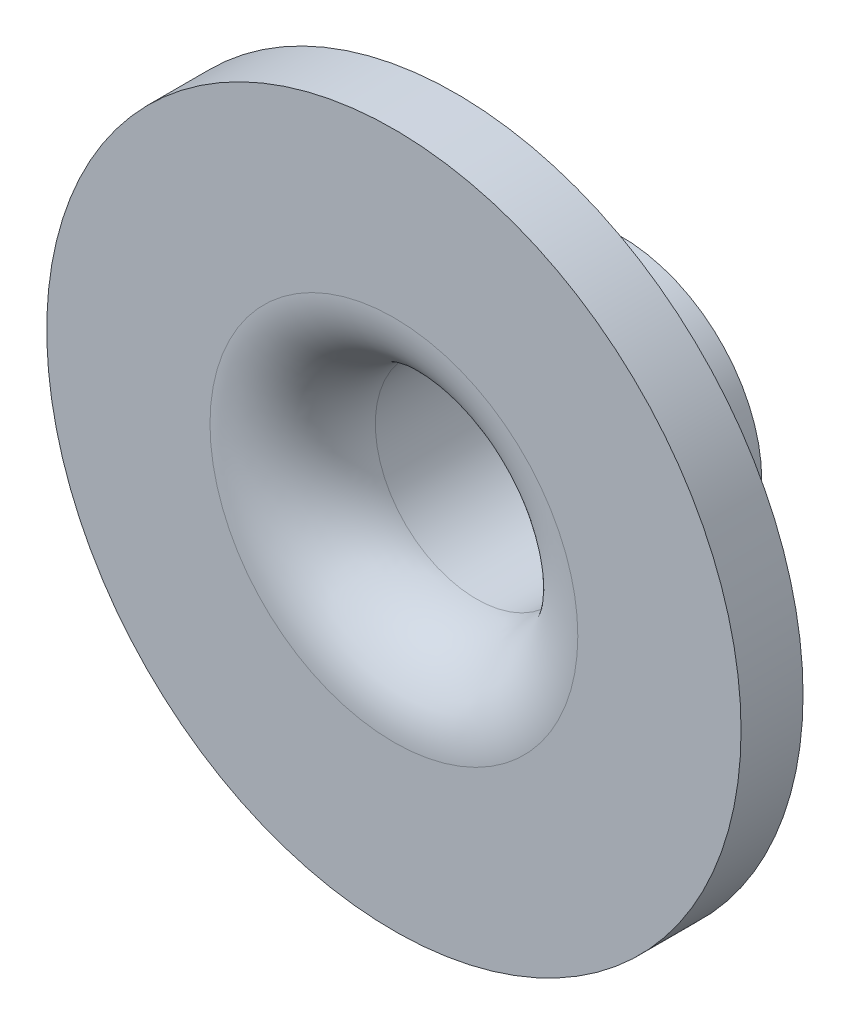
ISO-10303-21;
HEADER;
FILE_DESCRIPTION(('STEP AP214'),'2;1');
FILE_NAME('part.step','',(''),(''),'','','');
FILE_SCHEMA(('AUTOMOTIVE_DESIGN { 1 0 10303 214 1 1 1 1 }'));
ENDSEC;
DATA;
#1=APPLICATION_CONTEXT('core data for automotive mechanical design processes');
#2=APPLICATION_PROTOCOL_DEFINITION('international standard','automotive_design',2000,#1);
#3=PRODUCT_CONTEXT('',#1,'mechanical');
#4=PRODUCT('Part','Part','',(#3));
#5=PRODUCT_RELATED_PRODUCT_CATEGORY('part','',(#4));
#6=PRODUCT_DEFINITION_FORMATION('','',#4);
#7=PRODUCT_DEFINITION_CONTEXT('part definition',#1,'design');
#8=PRODUCT_DEFINITION('design','',#6,#7);
#9=PRODUCT_DEFINITION_SHAPE('','',#8);
#10=(LENGTH_UNIT() NAMED_UNIT(*) SI_UNIT(.MILLI.,.METRE.));
#11=(NAMED_UNIT(*) PLANE_ANGLE_UNIT() SI_UNIT($,.RADIAN.));
#12=(NAMED_UNIT(*) SI_UNIT($,.STERADIAN.) SOLID_ANGLE_UNIT());
#13=UNCERTAINTY_MEASURE_WITH_UNIT(LENGTH_MEASURE(1.E-05),#10,'distance_accuracy_value','');
#14=(GEOMETRIC_REPRESENTATION_CONTEXT(3) GLOBAL_UNCERTAINTY_ASSIGNED_CONTEXT((#13)) GLOBAL_UNIT_ASSIGNED_CONTEXT((#10,
#11,#12)) REPRESENTATION_CONTEXT('',''));
#15=CARTESIAN_POINT('',(0.,0.,0.));
#16=DIRECTION('',(0.,0.,1.));
#17=DIRECTION('',(1.,0.,0.));
#18=AXIS2_PLACEMENT_3D('',#15,#16,#17);
#19=CARTESIAN_POINT('',(0.,0.,5.5));
#20=DIRECTION('',(0.,0.,-1.));
#21=DIRECTION('',(-1.,0.,0.));
#22=AXIS2_PLACEMENT_3D('',#19,#20,#21);
#23=CYLINDRICAL_SURFACE('',#22,3.4);
#24=CARTESIAN_POINT('',(0.,0.,2.));
#25=DIRECTION('',(0.,0.,1.));
#26=DIRECTION('',(1.,0.,0.));
#27=AXIS2_PLACEMENT_3D('',#24,#25,#26);
#28=CIRCLE('',#27,3.4);
#29=CARTESIAN_POINT('',(3.4,0.,2.));
#30=VERTEX_POINT('',#29);
#31=EDGE_CURVE('E50',#30,#30,#28,.F.);
#32=ORIENTED_EDGE('',*,*,#31,.T.);
#33=EDGE_LOOP('',(#32));
#34=FACE_BOUND('',#33,.T.);
#35=CARTESIAN_POINT('',(0.,0.,0.));
#36=DIRECTION('',(0.,0.,1.));
#37=DIRECTION('',(1.,0.,0.));
#38=AXIS2_PLACEMENT_3D('',#35,#36,#37);
#39=CIRCLE('',#38,3.4);
#40=CARTESIAN_POINT('',(3.4,0.,0.));
#41=VERTEX_POINT('',#40);
#42=EDGE_CURVE('E59',#41,#41,#39,.T.);
#43=ORIENTED_EDGE('',*,*,#42,.T.);
#44=EDGE_LOOP('',(#43));
#45=FACE_BOUND('',#44,.T.);
#46=ADVANCED_FACE('F39',(#34,#45),#23,.T.);
#47=CARTESIAN_POINT('',(0.,0.,5.5));
#48=DIRECTION('',(0.,0.,1.));
#49=DIRECTION('',(1.,0.,0.));
#50=AXIS2_PLACEMENT_3D('',#47,#48,#49);
#51=PLANE('',#50);
#52=CARTESIAN_POINT('',(0.,0.,5.5));
#53=DIRECTION('',(0.,0.,1.));
#54=DIRECTION('',(1.,0.,0.));
#55=AXIS2_PLACEMENT_3D('',#52,#53,#54);
#56=CIRCLE('',#55,4.45);
#57=CARTESIAN_POINT('',(4.45,0.,5.5));
#58=VERTEX_POINT('',#57);
#59=EDGE_CURVE('E10',#58,#58,#56,.F.);
#60=ORIENTED_EDGE('',*,*,#59,.T.);
#61=EDGE_LOOP('',(#60));
#62=FACE_BOUND('',#61,.T.);
#63=CARTESIAN_POINT('',(0.,0.,5.5));
#64=DIRECTION('',(0.,0.,1.));
#65=DIRECTION('',(1.,0.,0.));
#66=AXIS2_PLACEMENT_3D('',#63,#64,#65);
#67=CIRCLE('',#66,8.4);
#68=CARTESIAN_POINT('',(8.4,0.,5.5));
#69=VERTEX_POINT('',#68);
#70=EDGE_CURVE('E66',#69,#69,#67,.T.);
#71=ORIENTED_EDGE('',*,*,#70,.T.);
#72=EDGE_LOOP('',(#71));
#73=FACE_BOUND('',#72,.T.);
#74=ADVANCED_FACE('F88',(#62,#73),#51,.T.);
#75=CARTESIAN_POINT('',(0.,0.,0.));
#76=DIRECTION('',(0.,0.,1.));
#77=DIRECTION('',(1.,0.,0.));
#78=AXIS2_PLACEMENT_3D('',#75,#76,#77);
#79=PLANE('',#78);
#80=ORIENTED_EDGE('',*,*,#42,.F.);
#81=EDGE_LOOP('',(#80));
#82=FACE_BOUND('',#81,.T.);
#83=CARTESIAN_POINT('',(0.,0.,0.));
#84=DIRECTION('',(0.,0.,1.));
#85=DIRECTION('',(1.,0.,0.));
#86=AXIS2_PLACEMENT_3D('',#83,#84,#85);
#87=CIRCLE('',#86,2.45);
#88=CARTESIAN_POINT('',(2.45,0.,0.));
#89=VERTEX_POINT('',#88);
#90=EDGE_CURVE('E62',#89,#89,#87,.T.);
#91=ORIENTED_EDGE('',*,*,#90,.T.);
#92=EDGE_LOOP('',(#91));
#93=FACE_BOUND('',#92,.T.);
#94=ADVANCED_FACE('F94',(#82,#93),#79,.F.);
#95=CARTESIAN_POINT('',(0.,0.,5.5));
#96=DIRECTION('',(0.,0.,-1.));
#97=DIRECTION('',(-1.,0.,0.));
#98=AXIS2_PLACEMENT_3D('',#95,#96,#97);
#99=CYLINDRICAL_SURFACE('',#98,2.45);
#100=CARTESIAN_POINT('',(0.,0.,3.5));
#101=DIRECTION('',(0.,0.,1.));
#102=DIRECTION('',(1.,0.,0.));
#103=AXIS2_PLACEMENT_3D('',#100,#101,#102);
#104=CIRCLE('',#103,2.45);
#105=CARTESIAN_POINT('',(2.45,0.,3.5));
#106=VERTEX_POINT('',#105);
#107=EDGE_CURVE('E46',#106,#106,#104,.T.);
#108=ORIENTED_EDGE('',*,*,#107,.T.);
#109=EDGE_LOOP('',(#108));
#110=FACE_BOUND('',#109,.T.);
#111=ORIENTED_EDGE('',*,*,#90,.F.);
#112=EDGE_LOOP('',(#111));
#113=FACE_BOUND('',#112,.T.);
#114=ADVANCED_FACE('F85',(#110,#113),#99,.F.);
#115=CARTESIAN_POINT('',(0.,0.,4.));
#116=DIRECTION('',(0.,0.,1.));
#117=DIRECTION('',(1.,0.,0.));
#118=AXIS2_PLACEMENT_3D('',#115,#116,#117);
#119=CYLINDRICAL_SURFACE('',#118,8.4);
#120=CARTESIAN_POINT('',(0.,0.,4.));
#121=DIRECTION('',(0.,0.,1.));
#122=DIRECTION('',(1.,0.,0.));
#123=AXIS2_PLACEMENT_3D('',#120,#121,#122);
#124=CIRCLE('',#123,8.4);
#125=CARTESIAN_POINT('',(8.4,0.,4.));
#126=VERTEX_POINT('',#125);
#127=EDGE_CURVE('E65',#126,#126,#124,.T.);
#128=ORIENTED_EDGE('',*,*,#127,.T.);
#129=EDGE_LOOP('',(#128));
#130=FACE_BOUND('',#129,.T.);
#131=ORIENTED_EDGE('',*,*,#70,.F.);
#132=EDGE_LOOP('',(#131));
#133=FACE_BOUND('',#132,.T.);
#134=ADVANCED_FACE('F72',(#130,#133),#119,.T.);
#135=CARTESIAN_POINT('',(0.,0.,4.));
#136=DIRECTION('',(0.,0.,1.));
#137=DIRECTION('',(1.,0.,0.));
#138=AXIS2_PLACEMENT_3D('',#135,#136,#137);
#139=PLANE('',#138);
#140=CARTESIAN_POINT('',(0.,0.,4.));
#141=DIRECTION('',(0.,0.,1.));
#142=DIRECTION('',(1.,0.,0.));
#143=AXIS2_PLACEMENT_3D('',#140,#141,#142);
#144=CIRCLE('',#143,5.4);
#145=CARTESIAN_POINT('',(5.4,0.,4.));
#146=VERTEX_POINT('',#145);
#147=EDGE_CURVE('E54',#146,#146,#144,.T.);
#148=ORIENTED_EDGE('',*,*,#147,.T.);
#149=EDGE_LOOP('',(#148));
#150=FACE_BOUND('',#149,.T.);
#151=ORIENTED_EDGE('',*,*,#127,.F.);
#152=EDGE_LOOP('',(#151));
#153=FACE_BOUND('',#152,.T.);
#154=ADVANCED_FACE('F75',(#150,#153),#139,.F.);
#155=CARTESIAN_POINT('',(0.,0.,2.));
#156=DIRECTION('',(0.,0.,1.));
#157=DIRECTION('',(1.,0.,0.));
#158=AXIS2_PLACEMENT_3D('',#155,#156,#157);
#159=TOROIDAL_SURFACE('',#158,5.4,2.);
#160=ORIENTED_EDGE('',*,*,#31,.F.);
#161=EDGE_LOOP('',(#160));
#162=FACE_BOUND('',#161,.T.);
#163=ORIENTED_EDGE('',*,*,#147,.F.);
#164=EDGE_LOOP('',(#163));
#165=FACE_BOUND('',#164,.T.);
#166=ADVANCED_FACE('F77',(#162,#165),#159,.F.);
#167=CARTESIAN_POINT('',(0.,0.,3.5));
#168=DIRECTION('',(0.,0.,1.));
#169=DIRECTION('',(1.,0.,0.));
#170=AXIS2_PLACEMENT_3D('',#167,#168,#169);
#171=TOROIDAL_SURFACE('',#170,4.45,2.);
#172=ORIENTED_EDGE('',*,*,#59,.F.);
#173=EDGE_LOOP('',(#172));
#174=FACE_BOUND('',#173,.T.);
#175=ORIENTED_EDGE('',*,*,#107,.F.);
#176=EDGE_LOOP('',(#175));
#177=FACE_BOUND('',#176,.T.);
#178=ADVANCED_FACE('F41',(#174,#177),#171,.T.);
#179=CLOSED_SHELL('',(#46,#74,#94,#114,#134,#154,#166,#178));
#180=MANIFOLD_SOLID_BREP('B2',#179);
#181=ADVANCED_BREP_SHAPE_REPRESENTATION('',(#18,#180),#14);
#182=SHAPE_DEFINITION_REPRESENTATION(#9,#181);
ENDSEC;
END-ISO-10303-21;
